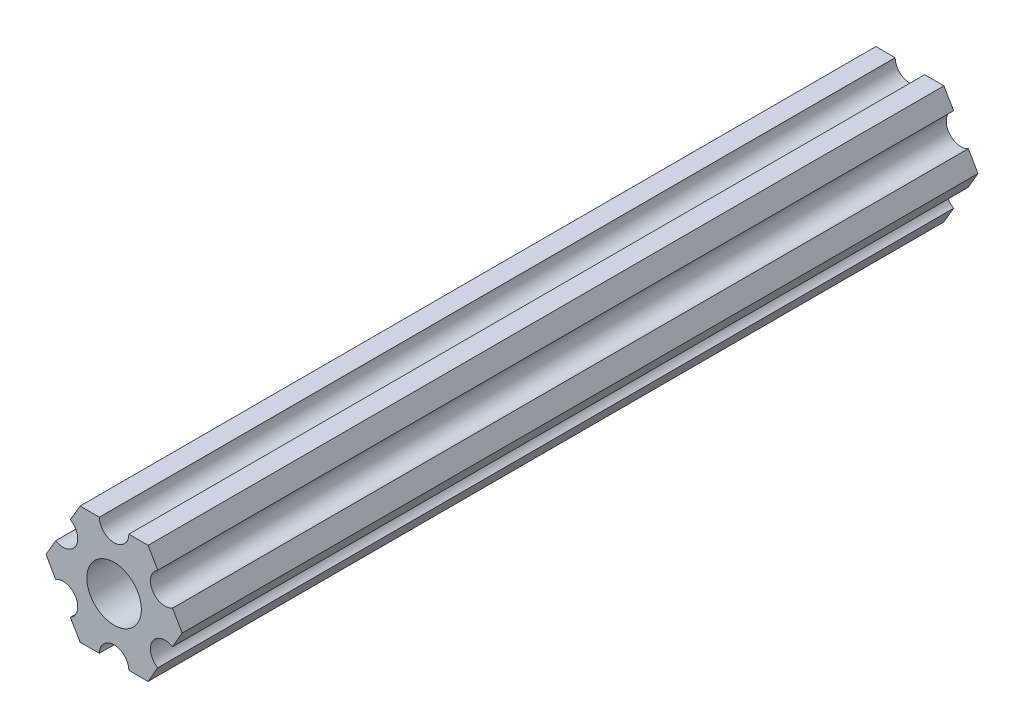
ISO-10303-21;
HEADER;
FILE_DESCRIPTION(('STEP AP214'),'2;1');
FILE_NAME('part.step','',(''),(''),'','','');
FILE_SCHEMA(('AUTOMOTIVE_DESIGN { 1 0 10303 214 1 1 1 1 }'));
ENDSEC;
DATA;
#1=APPLICATION_CONTEXT('core data for automotive mechanical design processes');
#2=APPLICATION_PROTOCOL_DEFINITION('international standard','automotive_design',2000,#1);
#3=PRODUCT_CONTEXT('',#1,'mechanical');
#4=PRODUCT('Part','Part','',(#3));
#5=PRODUCT_RELATED_PRODUCT_CATEGORY('part','',(#4));
#6=PRODUCT_DEFINITION_FORMATION('','',#4);
#7=PRODUCT_DEFINITION_CONTEXT('part definition',#1,'design');
#8=PRODUCT_DEFINITION('design','',#6,#7);
#9=PRODUCT_DEFINITION_SHAPE('','',#8);
#10=(LENGTH_UNIT() NAMED_UNIT(*) SI_UNIT(.MILLI.,.METRE.));
#11=(NAMED_UNIT(*) PLANE_ANGLE_UNIT() SI_UNIT($,.RADIAN.));
#12=(NAMED_UNIT(*) SI_UNIT($,.STERADIAN.) SOLID_ANGLE_UNIT());
#13=UNCERTAINTY_MEASURE_WITH_UNIT(LENGTH_MEASURE(1.E-05),#10,'distance_accuracy_value','');
#14=(GEOMETRIC_REPRESENTATION_CONTEXT(3) GLOBAL_UNCERTAINTY_ASSIGNED_CONTEXT((#13)) GLOBAL_UNIT_ASSIGNED_CONTEXT((#10,
#11,#12)) REPRESENTATION_CONTEXT('',''));
#15=CARTESIAN_POINT('',(0.,0.,0.));
#16=DIRECTION('',(0.,0.,1.));
#17=DIRECTION('',(1.,0.,0.));
#18=AXIS2_PLACEMENT_3D('',#15,#16,#17);
#19=CARTESIAN_POINT('',(5.49926169873049,-3.17500022210629,219.075));
#20=DIRECTION('',(0.,0.,1.));
#21=DIRECTION('',(1.,0.,0.));
#22=AXIS2_PLACEMENT_3D('',#19,#20,#21);
#23=CYLINDRICAL_SURFACE('',#22,1.5875);
#24=CARTESIAN_POINT('',(5.49926169873049,-3.17500022210629,304.8));
#25=DIRECTION('',(0.,0.,-1.));
#26=DIRECTION('',(-1.,0.,0.));
#27=AXIS2_PLACEMENT_3D('',#24,#25,#26);
#28=CIRCLE('',#27,1.5875);
#29=CARTESIAN_POINT('',(4.7055116987305,-4.5498155506141,304.8));
#30=VERTEX_POINT('',#29);
#31=CARTESIAN_POINT('',(6.29301169873047,-1.80018489359848,304.8));
#32=VERTEX_POINT('',#31);
#33=EDGE_CURVE('E190',#30,#32,#28,.T.);
#34=ORIENTED_EDGE('',*,*,#33,.F.);
#35=DIRECTION('',(0.,0.,1.));
#36=VECTOR('',#35,1.);
#37=CARTESIAN_POINT('',(4.7055116987305,-4.5498155506141,219.075));
#38=LINE('',#37,#36);
#39=CARTESIAN_POINT('',(4.7055116987305,-4.5498155506141,219.075));
#40=VERTEX_POINT('',#39);
#41=EDGE_CURVE('E11',#40,#30,#38,.T.);
#42=ORIENTED_EDGE('',*,*,#41,.F.);
#43=CARTESIAN_POINT('',(5.49926169873049,-3.17500022210629,219.075));
#44=DIRECTION('',(0.,0.,-1.));
#45=DIRECTION('',(-1.,0.,0.));
#46=AXIS2_PLACEMENT_3D('',#43,#44,#45);
#47=CIRCLE('',#46,1.5875);
#48=CARTESIAN_POINT('',(6.29301169873047,-1.80018489359848,219.075));
#49=VERTEX_POINT('',#48);
#50=EDGE_CURVE('E241',#40,#49,#47,.T.);
#51=ORIENTED_EDGE('',*,*,#50,.T.);
#52=DIRECTION('',(0.,0.,1.));
#53=VECTOR('',#52,1.);
#54=CARTESIAN_POINT('',(6.29301169873047,-1.80018489359848,219.075));
#55=LINE('',#54,#53);
#56=EDGE_CURVE('E36',#49,#32,#55,.T.);
#57=ORIENTED_EDGE('',*,*,#56,.T.);
#58=EDGE_LOOP('',(#34,#42,#51,#57));
#59=FACE_BOUND('',#58,.T.);
#60=ADVANCED_FACE('F33',(#59),#23,.F.);
#61=CARTESIAN_POINT('',(3.6661745940535,-6.35000022210627,219.075));
#62=DIRECTION('',(0.866025403784446,-0.499999999999988,0.));
#63=DIRECTION('',(0.499999999999988,0.866025403784446,0.));
#64=AXIS2_PLACEMENT_3D('',#61,#62,#63);
#65=PLANE('',#64);
#66=DIRECTION('',(0.499999999999988,0.866025403784446,0.));
#67=VECTOR('',#66,1.);
#68=CARTESIAN_POINT('',(3.6661745940535,-6.35000022210627,304.8));
#69=LINE('',#68,#67);
#70=CARTESIAN_POINT('',(3.6661745940535,-6.35000022210627,304.8));
#71=VERTEX_POINT('',#70);
#72=EDGE_CURVE('E239',#71,#30,#69,.T.);
#73=ORIENTED_EDGE('',*,*,#72,.F.);
#74=DIRECTION('',(0.,0.,1.));
#75=VECTOR('',#74,1.);
#76=CARTESIAN_POINT('',(3.6661745940535,-6.35000022210627,219.075));
#77=LINE('',#76,#75);
#78=CARTESIAN_POINT('',(3.6661745940535,-6.35000022210627,219.075));
#79=VERTEX_POINT('',#78);
#80=EDGE_CURVE('E42',#79,#71,#77,.T.);
#81=ORIENTED_EDGE('',*,*,#80,.F.);
#82=DIRECTION('',(0.499999999999988,0.866025403784446,0.));
#83=VECTOR('',#82,1.);
#84=CARTESIAN_POINT('',(3.6661745940535,-6.35000022210627,219.075));
#85=LINE('',#84,#83);
#86=EDGE_CURVE('E180',#79,#40,#85,.T.);
#87=ORIENTED_EDGE('',*,*,#86,.T.);
#88=ORIENTED_EDGE('',*,*,#41,.T.);
#89=EDGE_LOOP('',(#73,#81,#87,#88));
#90=FACE_BOUND('',#89,.T.);
#91=ADVANCED_FACE('F273',(#90),#65,.T.);
#92=CARTESIAN_POINT('',(1.58750038469929,-6.35000022210627,219.075));
#93=DIRECTION('',(0.,-1.,0.));
#94=DIRECTION('',(0.,0.,-1.));
#95=AXIS2_PLACEMENT_3D('',#92,#93,#94);
#96=PLANE('',#95);
#97=DIRECTION('',(1.,0.,0.));
#98=VECTOR('',#97,1.);
#99=CARTESIAN_POINT('',(1.58750038469929,-6.35000022210627,304.8));
#100=LINE('',#99,#98);
#101=CARTESIAN_POINT('',(1.58750038469929,-6.35000022210627,304.8));
#102=VERTEX_POINT('',#101);
#103=EDGE_CURVE('E167',#102,#71,#100,.T.);
#104=ORIENTED_EDGE('',*,*,#103,.F.);
#105=DIRECTION('',(0.,0.,1.));
#106=VECTOR('',#105,1.);
#107=CARTESIAN_POINT('',(1.58750038469929,-6.35000022210627,219.075));
#108=LINE('',#107,#106);
#109=CARTESIAN_POINT('',(1.58750038469929,-6.35000022210627,219.075));
#110=VERTEX_POINT('',#109);
#111=EDGE_CURVE('E162',#110,#102,#108,.T.);
#112=ORIENTED_EDGE('',*,*,#111,.F.);
#113=DIRECTION('',(1.,0.,0.));
#114=VECTOR('',#113,1.);
#115=CARTESIAN_POINT('',(1.58750038469929,-6.35000022210627,219.075));
#116=LINE('',#115,#114);
#117=EDGE_CURVE('E165',#110,#79,#116,.T.);
#118=ORIENTED_EDGE('',*,*,#117,.T.);
#119=ORIENTED_EDGE('',*,*,#80,.T.);
#120=EDGE_LOOP('',(#104,#112,#118,#119));
#121=FACE_BOUND('',#120,.T.);
#122=ADVANCED_FACE('F164',(#121),#96,.T.);
#123=CARTESIAN_POINT('',(3.84699290671026E-07,-6.35000022210627,219.075));
#124=DIRECTION('',(0.,0.,1.));
#125=DIRECTION('',(1.,0.,0.));
#126=AXIS2_PLACEMENT_3D('',#123,#124,#125);
#127=CYLINDRICAL_SURFACE('',#126,1.5875);
#128=CARTESIAN_POINT('',(3.84699290671026E-07,-6.35000022210627,304.8));
#129=DIRECTION('',(0.,0.,-1.));
#130=DIRECTION('',(-1.,0.,0.));
#131=AXIS2_PLACEMENT_3D('',#128,#129,#130);
#132=CIRCLE('',#131,1.5875);
#133=CARTESIAN_POINT('',(-1.58749961530071,-6.35000022210627,304.8));
#134=VERTEX_POINT('',#133);
#135=EDGE_CURVE('E236',#134,#102,#132,.T.);
#136=ORIENTED_EDGE('',*,*,#135,.F.);
#137=DIRECTION('',(0.,0.,1.));
#138=VECTOR('',#137,1.);
#139=CARTESIAN_POINT('',(-1.58749961530071,-6.35000022210627,219.075));
#140=LINE('',#139,#138);
#141=CARTESIAN_POINT('',(-1.58749961530071,-6.35000022210627,219.075));
#142=VERTEX_POINT('',#141);
#143=EDGE_CURVE('E172',#142,#134,#140,.T.);
#144=ORIENTED_EDGE('',*,*,#143,.F.);
#145=CARTESIAN_POINT('',(3.84699290671026E-07,-6.35000022210627,219.075));
#146=DIRECTION('',(0.,0.,-1.));
#147=DIRECTION('',(-1.,0.,0.));
#148=AXIS2_PLACEMENT_3D('',#145,#146,#147);
#149=CIRCLE('',#148,1.5875);
#150=EDGE_CURVE('E178',#142,#110,#149,.T.);
#151=ORIENTED_EDGE('',*,*,#150,.T.);
#152=ORIENTED_EDGE('',*,*,#111,.T.);
#153=EDGE_LOOP('',(#136,#144,#151,#152));
#154=FACE_BOUND('',#153,.T.);
#155=ADVANCED_FACE('F182',(#154),#127,.F.);
#156=CARTESIAN_POINT('',(-3.66617382465478,-6.35000022210627,219.075));
#157=DIRECTION('',(0.,-1.,0.));
#158=DIRECTION('',(1.,0.,0.));
#159=AXIS2_PLACEMENT_3D('',#156,#157,#158);
#160=PLANE('',#159);
#161=DIRECTION('',(1.,0.,0.));
#162=VECTOR('',#161,1.);
#163=CARTESIAN_POINT('',(-3.66617382465478,-6.35000022210627,304.8));
#164=LINE('',#163,#162);
#165=CARTESIAN_POINT('',(-3.66617382465478,-6.35000022210627,304.8));
#166=VERTEX_POINT('',#165);
#167=EDGE_CURVE('E233',#166,#134,#164,.T.);
#168=ORIENTED_EDGE('',*,*,#167,.F.);
#169=DIRECTION('',(0.,0.,1.));
#170=VECTOR('',#169,1.);
#171=CARTESIAN_POINT('',(-3.66617382465478,-6.35000022210627,219.075));
#172=LINE('',#171,#170);
#173=CARTESIAN_POINT('',(-3.66617382465478,-6.35000022210627,219.075));
#174=VERTEX_POINT('',#173);
#175=EDGE_CURVE('E245',#174,#166,#172,.T.);
#176=ORIENTED_EDGE('',*,*,#175,.F.);
#177=DIRECTION('',(1.,0.,0.));
#178=VECTOR('',#177,1.);
#179=CARTESIAN_POINT('',(-3.66617382465478,-6.35000022210627,219.075));
#180=LINE('',#179,#178);
#181=EDGE_CURVE('E183',#174,#142,#180,.T.);
#182=ORIENTED_EDGE('',*,*,#181,.T.);
#183=ORIENTED_EDGE('',*,*,#143,.T.);
#184=EDGE_LOOP('',(#168,#176,#182,#183));
#185=FACE_BOUND('',#184,.T.);
#186=ADVANCED_FACE('F286',(#185),#160,.T.);
#187=CARTESIAN_POINT('',(-4.70551103839171,-4.54981561357971,219.075));
#188=DIRECTION('',(-0.866025373493149,-0.500000052466048,0.));
#189=DIRECTION('',(0.500000052466048,-0.866025373493149,0.));
#190=AXIS2_PLACEMENT_3D('',#187,#188,#189);
#191=PLANE('',#190);
#192=DIRECTION('',(0.500000052466048,-0.866025373493149,0.));
#193=VECTOR('',#192,1.);
#194=CARTESIAN_POINT('',(-4.70551103839171,-4.54981561357971,304.8));
#195=LINE('',#194,#193);
#196=CARTESIAN_POINT('',(-4.70551103839171,-4.54981561357971,304.8));
#197=VERTEX_POINT('',#196);
#198=EDGE_CURVE('E230',#197,#166,#195,.T.);
#199=ORIENTED_EDGE('',*,*,#198,.F.);
#200=DIRECTION('',(0.,0.,1.));
#201=VECTOR('',#200,1.);
#202=CARTESIAN_POINT('',(-4.70551103839171,-4.54981561357971,219.075));
#203=LINE('',#202,#201);
#204=CARTESIAN_POINT('',(-4.70551103839171,-4.54981561357971,219.075));
#205=VERTEX_POINT('',#204);
#206=EDGE_CURVE('E247',#205,#197,#203,.T.);
#207=ORIENTED_EDGE('',*,*,#206,.F.);
#208=DIRECTION('',(0.500000052466048,-0.866025373493149,0.));
#209=VECTOR('',#208,1.);
#210=CARTESIAN_POINT('',(-4.70551103839171,-4.54981561357971,219.075));
#211=LINE('',#210,#209);
#212=EDGE_CURVE('E185',#205,#174,#211,.T.);
#213=ORIENTED_EDGE('',*,*,#212,.T.);
#214=ORIENTED_EDGE('',*,*,#175,.T.);
#215=EDGE_LOOP('',(#199,#207,#213,#214));
#216=FACE_BOUND('',#215,.T.);
#217=ADVANCED_FACE('F289',(#216),#191,.T.);
#218=CARTESIAN_POINT('',(-5.49926112168156,-3.17500033315934,219.075));
#219=DIRECTION('',(0.,0.,1.));
#220=DIRECTION('',(1.,0.,0.));
#221=AXIS2_PLACEMENT_3D('',#218,#219,#220);
#222=CYLINDRICAL_SURFACE('',#221,1.5875);
#223=CARTESIAN_POINT('',(-5.49926112168156,-3.17500033315934,304.8));
#224=DIRECTION('',(0.,0.,-1.));
#225=DIRECTION('',(-1.,0.,0.));
#226=AXIS2_PLACEMENT_3D('',#223,#224,#225);
#227=CIRCLE('',#226,1.5875);
#228=CARTESIAN_POINT('',(-6.29301120497141,-1.80018505273897,304.8));
#229=VERTEX_POINT('',#228);
#230=EDGE_CURVE('E227',#229,#197,#227,.T.);
#231=ORIENTED_EDGE('',*,*,#230,.F.);
#232=DIRECTION('',(0.,0.,1.));
#233=VECTOR('',#232,1.);
#234=CARTESIAN_POINT('',(-6.29301120497141,-1.80018505273897,219.075));
#235=LINE('',#234,#233);
#236=CARTESIAN_POINT('',(-6.29301120497141,-1.80018505273897,219.075));
#237=VERTEX_POINT('',#236);
#238=EDGE_CURVE('E249',#237,#229,#235,.T.);
#239=ORIENTED_EDGE('',*,*,#238,.F.);
#240=CARTESIAN_POINT('',(-5.49926112168156,-3.17500033315934,219.075));
#241=DIRECTION('',(0.,0.,-1.));
#242=DIRECTION('',(-1.,0.,0.));
#243=AXIS2_PLACEMENT_3D('',#240,#241,#242);
#244=CIRCLE('',#243,1.5875);
#245=EDGE_CURVE('E394',#237,#205,#244,.T.);
#246=ORIENTED_EDGE('',*,*,#245,.T.);
#247=ORIENTED_EDGE('',*,*,#206,.T.);
#248=EDGE_LOOP('',(#231,#239,#246,#247));
#249=FACE_BOUND('',#248,.T.);
#250=ADVANCED_FACE('F293',(#249),#222,.F.);
#251=CARTESIAN_POINT('',(-7.33234841870827,-4.44212523790841E-07,219.075));
#252=DIRECTION('',(-0.86602537349315,-0.500000052466048,0.));
#253=DIRECTION('',(0.500000052466048,-0.86602537349315,0.));
#254=AXIS2_PLACEMENT_3D('',#251,#252,#253);
#255=PLANE('',#254);
#256=DIRECTION('',(0.500000052466048,-0.86602537349315,0.));
#257=VECTOR('',#256,1.);
#258=CARTESIAN_POINT('',(-7.33234841870827,-4.44212523790841E-07,304.8));
#259=LINE('',#258,#257);
#260=CARTESIAN_POINT('',(-7.33234841870827,-4.44212523790841E-07,304.8));
#261=VERTEX_POINT('',#260);
#262=EDGE_CURVE('E224',#261,#229,#259,.T.);
#263=ORIENTED_EDGE('',*,*,#262,.F.);
#264=DIRECTION('',(0.,0.,1.));
#265=VECTOR('',#264,1.);
#266=CARTESIAN_POINT('',(-7.33234841870827,-4.44212523790841E-07,219.075));
#267=LINE('',#266,#265);
#268=CARTESIAN_POINT('',(-7.33234841870827,-4.44212523790841E-07,219.075));
#269=VERTEX_POINT('',#268);
#270=EDGE_CURVE('E251',#269,#261,#267,.T.);
#271=ORIENTED_EDGE('',*,*,#270,.F.);
#272=DIRECTION('',(0.500000052466048,-0.86602537349315,0.));
#273=VECTOR('',#272,1.);
#274=CARTESIAN_POINT('',(-7.33234841870827,-4.44212523790841E-07,219.075));
#275=LINE('',#274,#273);
#276=EDGE_CURVE('E391',#269,#237,#275,.T.);
#277=ORIENTED_EDGE('',*,*,#276,.T.);
#278=ORIENTED_EDGE('',*,*,#238,.T.);
#279=EDGE_LOOP('',(#263,#271,#277,#278));
#280=FACE_BOUND('',#279,.T.);
#281=ADVANCED_FACE('F297',(#280),#255,.T.);
#282=CARTESIAN_POINT('',(-6.29301142309098,1.80018429024547,219.075));
#283=DIRECTION('',(-0.866025434075722,0.499999947533955,0.));
#284=DIRECTION('',(-0.499999947533955,-0.866025434075722,0.));
#285=AXIS2_PLACEMENT_3D('',#282,#283,#284);
#286=PLANE('',#285);
#287=DIRECTION('',(-0.499999947533955,-0.866025434075722,0.));
#288=VECTOR('',#287,1.);
#289=CARTESIAN_POINT('',(-6.29301142309098,1.80018429024547,304.8));
#290=LINE('',#289,#288);
#291=CARTESIAN_POINT('',(-6.29301142309098,1.80018429024546,304.8));
#292=VERTEX_POINT('',#291);
#293=EDGE_CURVE('E221',#292,#261,#290,.T.);
#294=ORIENTED_EDGE('',*,*,#293,.F.);
#295=DIRECTION('',(0.,0.,1.));
#296=VECTOR('',#295,1.);
#297=CARTESIAN_POINT('',(-6.29301142309098,1.80018429024546,219.075));
#298=LINE('',#297,#296);
#299=CARTESIAN_POINT('',(-6.29301142309098,1.80018429024546,219.075));
#300=VERTEX_POINT('',#299);
#301=EDGE_CURVE('E253',#300,#292,#298,.T.);
#302=ORIENTED_EDGE('',*,*,#301,.F.);
#303=DIRECTION('',(-0.499999947533955,-0.866025434075722,0.));
#304=VECTOR('',#303,1.);
#305=CARTESIAN_POINT('',(-6.29301142309098,1.80018429024547,219.075));
#306=LINE('',#305,#304);
#307=EDGE_CURVE('E388',#300,#269,#306,.T.);
#308=ORIENTED_EDGE('',*,*,#307,.T.);
#309=ORIENTED_EDGE('',*,*,#270,.T.);
#310=EDGE_LOOP('',(#294,#302,#308,#309));
#311=FACE_BOUND('',#310,.T.);
#312=ADVANCED_FACE('F301',(#311),#286,.T.);
#313=CARTESIAN_POINT('',(-5.49926150638083,3.17499966684067,219.075));
#314=DIRECTION('',(0.,0.,1.));
#315=DIRECTION('',(1.,0.,0.));
#316=AXIS2_PLACEMENT_3D('',#313,#314,#315);
#317=CYLINDRICAL_SURFACE('',#316,1.5875);
#318=CARTESIAN_POINT('',(-5.49926150638083,3.17499966684067,304.8));
#319=DIRECTION('',(0.,0.,-1.));
#320=DIRECTION('',(-1.,0.,0.));
#321=AXIS2_PLACEMENT_3D('',#318,#319,#320);
#322=CIRCLE('',#321,1.5875);
#323=CARTESIAN_POINT('',(-4.70551158967067,4.54981504343588,304.8));
#324=VERTEX_POINT('',#323);
#325=EDGE_CURVE('E218',#324,#292,#322,.T.);
#326=ORIENTED_EDGE('',*,*,#325,.F.);
#327=DIRECTION('',(0.,0.,1.));
#328=VECTOR('',#327,1.);
#329=CARTESIAN_POINT('',(-4.70551158967067,4.54981504343588,219.075));
#330=LINE('',#329,#328);
#331=CARTESIAN_POINT('',(-4.70551158967067,4.54981504343588,219.075));
#332=VERTEX_POINT('',#331);
#333=EDGE_CURVE('E255',#332,#324,#330,.T.);
#334=ORIENTED_EDGE('',*,*,#333,.F.);
#335=CARTESIAN_POINT('',(-5.49926150638083,3.17499966684067,219.075));
#336=DIRECTION('',(0.,0.,-1.));
#337=DIRECTION('',(-1.,0.,0.));
#338=AXIS2_PLACEMENT_3D('',#335,#336,#337);
#339=CIRCLE('',#338,1.5875);
#340=EDGE_CURVE('E385',#332,#300,#339,.T.);
#341=ORIENTED_EDGE('',*,*,#340,.T.);
#342=ORIENTED_EDGE('',*,*,#301,.T.);
#343=EDGE_LOOP('',(#326,#334,#341,#342));
#344=FACE_BOUND('',#343,.T.);
#345=ADVANCED_FACE('F305',(#344),#317,.F.);
#346=CARTESIAN_POINT('',(-3.66617459405348,6.3499997778937,219.075));
#347=DIRECTION('',(-0.866025434075722,0.499999947533955,0.));
#348=DIRECTION('',(-0.499999947533955,-0.866025434075722,0.));
#349=AXIS2_PLACEMENT_3D('',#346,#347,#348);
#350=PLANE('',#349);
#351=DIRECTION('',(-0.499999947533955,-0.866025434075722,0.));
#352=VECTOR('',#351,1.);
#353=CARTESIAN_POINT('',(-3.66617459405348,6.3499997778937,304.8));
#354=LINE('',#353,#352);
#355=CARTESIAN_POINT('',(-3.66617459405348,6.3499997778937,304.8));
#356=VERTEX_POINT('',#355);
#357=EDGE_CURVE('E215',#356,#324,#354,.T.);
#358=ORIENTED_EDGE('',*,*,#357,.F.);
#359=DIRECTION('',(0.,0.,1.));
#360=VECTOR('',#359,1.);
#361=CARTESIAN_POINT('',(-3.66617459405348,6.3499997778937,219.075));
#362=LINE('',#361,#360);
#363=CARTESIAN_POINT('',(-3.66617459405348,6.3499997778937,219.075));
#364=VERTEX_POINT('',#363);
#365=EDGE_CURVE('E257',#364,#356,#362,.T.);
#366=ORIENTED_EDGE('',*,*,#365,.F.);
#367=DIRECTION('',(-0.499999947533955,-0.866025434075722,0.));
#368=VECTOR('',#367,1.);
#369=CARTESIAN_POINT('',(-3.66617459405348,6.3499997778937,219.075));
#370=LINE('',#369,#368);
#371=EDGE_CURVE('E382',#364,#332,#370,.T.);
#372=ORIENTED_EDGE('',*,*,#371,.T.);
#373=ORIENTED_EDGE('',*,*,#333,.T.);
#374=EDGE_LOOP('',(#358,#366,#372,#373));
#375=FACE_BOUND('',#374,.T.);
#376=ADVANCED_FACE('F309',(#375),#350,.T.);
#377=CARTESIAN_POINT('',(-1.58750038469926,6.3499997778937,219.075));
#378=DIRECTION('',(0.,1.,0.));
#379=DIRECTION('',(0.,0.,1.));
#380=AXIS2_PLACEMENT_3D('',#377,#378,#379);
#381=PLANE('',#380);
#382=DIRECTION('',(-1.,0.,0.));
#383=VECTOR('',#382,1.);
#384=CARTESIAN_POINT('',(-1.58750038469926,6.3499997778937,304.8));
#385=LINE('',#384,#383);
#386=CARTESIAN_POINT('',(-1.58750038469926,6.3499997778937,304.8));
#387=VERTEX_POINT('',#386);
#388=EDGE_CURVE('E212',#387,#356,#385,.T.);
#389=ORIENTED_EDGE('',*,*,#388,.F.);
#390=DIRECTION('',(0.,0.,1.));
#391=VECTOR('',#390,1.);
#392=CARTESIAN_POINT('',(-1.58750038469926,6.3499997778937,219.075));
#393=LINE('',#392,#391);
#394=CARTESIAN_POINT('',(-1.58750038469926,6.3499997778937,219.075));
#395=VERTEX_POINT('',#394);
#396=EDGE_CURVE('E259',#395,#387,#393,.T.);
#397=ORIENTED_EDGE('',*,*,#396,.F.);
#398=DIRECTION('',(-1.,0.,0.));
#399=VECTOR('',#398,1.);
#400=CARTESIAN_POINT('',(-1.58750038469926,6.3499997778937,219.075));
#401=LINE('',#400,#399);
#402=EDGE_CURVE('E379',#395,#364,#401,.T.);
#403=ORIENTED_EDGE('',*,*,#402,.T.);
#404=ORIENTED_EDGE('',*,*,#365,.T.);
#405=EDGE_LOOP('',(#389,#397,#403,#404));
#406=FACE_BOUND('',#405,.T.);
#407=ADVANCED_FACE('F313',(#406),#381,.T.);
#408=CARTESIAN_POINT('',(-3.84699252021695E-07,6.3499997778937,219.075));
#409=DIRECTION('',(0.,0.,1.));
#410=DIRECTION('',(1.,0.,0.));
#411=AXIS2_PLACEMENT_3D('',#408,#409,#410);
#412=CYLINDRICAL_SURFACE('',#411,1.5875);
#413=CARTESIAN_POINT('',(-3.84699252021695E-07,6.3499997778937,304.8));
#414=DIRECTION('',(0.,0.,-1.));
#415=DIRECTION('',(-1.,0.,0.));
#416=AXIS2_PLACEMENT_3D('',#413,#414,#415);
#417=CIRCLE('',#416,1.5875);
#418=CARTESIAN_POINT('',(1.58749961530075,6.3499997778937,304.8));
#419=VERTEX_POINT('',#418);
#420=EDGE_CURVE('E209',#419,#387,#417,.T.);
#421=ORIENTED_EDGE('',*,*,#420,.F.);
#422=DIRECTION('',(0.,0.,1.));
#423=VECTOR('',#422,1.);
#424=CARTESIAN_POINT('',(1.58749961530075,6.3499997778937,219.075));
#425=LINE('',#424,#423);
#426=CARTESIAN_POINT('',(1.58749961530075,6.3499997778937,219.075));
#427=VERTEX_POINT('',#426);
#428=EDGE_CURVE('E261',#427,#419,#425,.T.);
#429=ORIENTED_EDGE('',*,*,#428,.F.);
#430=CARTESIAN_POINT('',(-3.84699252021695E-07,6.3499997778937,219.075));
#431=DIRECTION('',(0.,0.,-1.));
#432=DIRECTION('',(-1.,0.,0.));
#433=AXIS2_PLACEMENT_3D('',#430,#431,#432);
#434=CIRCLE('',#433,1.5875);
#435=EDGE_CURVE('E376',#427,#395,#434,.T.);
#436=ORIENTED_EDGE('',*,*,#435,.T.);
#437=ORIENTED_EDGE('',*,*,#396,.T.);
#438=EDGE_LOOP('',(#421,#429,#436,#437));
#439=FACE_BOUND('',#438,.T.);
#440=ADVANCED_FACE('F317',(#439),#412,.F.);
#441=CARTESIAN_POINT('',(3.66617382465482,6.3499997778937,219.075));
#442=DIRECTION('',(0.,1.,0.));
#443=DIRECTION('',(0.,0.,1.));
#444=AXIS2_PLACEMENT_3D('',#441,#442,#443);
#445=PLANE('',#444);
#446=DIRECTION('',(-1.,0.,0.));
#447=VECTOR('',#446,1.);
#448=CARTESIAN_POINT('',(3.66617382465482,6.3499997778937,304.8));
#449=LINE('',#448,#447);
#450=CARTESIAN_POINT('',(3.66617382465482,6.3499997778937,304.8));
#451=VERTEX_POINT('',#450);
#452=EDGE_CURVE('E206',#451,#419,#449,.T.);
#453=ORIENTED_EDGE('',*,*,#452,.F.);
#454=DIRECTION('',(0.,0.,1.));
#455=VECTOR('',#454,1.);
#456=CARTESIAN_POINT('',(3.66617382465482,6.3499997778937,219.075));
#457=LINE('',#456,#455);
#458=CARTESIAN_POINT('',(3.66617382465482,6.3499997778937,219.075));
#459=VERTEX_POINT('',#458);
#460=EDGE_CURVE('E263',#459,#451,#457,.T.);
#461=ORIENTED_EDGE('',*,*,#460,.F.);
#462=DIRECTION('',(-1.,0.,0.));
#463=VECTOR('',#462,1.);
#464=CARTESIAN_POINT('',(3.66617382465482,6.3499997778937,219.075));
#465=LINE('',#464,#463);
#466=EDGE_CURVE('E373',#459,#427,#465,.T.);
#467=ORIENTED_EDGE('',*,*,#466,.T.);
#468=ORIENTED_EDGE('',*,*,#428,.T.);
#469=EDGE_LOOP('',(#453,#461,#467,#468));
#470=FACE_BOUND('',#469,.T.);
#471=ADVANCED_FACE('F321',(#470),#445,.T.);
#472=CARTESIAN_POINT('',(4.70551118909646,4.54981503427038,219.075));
#473=DIRECTION('',(0.866025358347505,0.500000078699069,0.));
#474=DIRECTION('',(-0.500000078699069,0.866025358347505,0.));
#475=AXIS2_PLACEMENT_3D('',#472,#473,#474);
#476=PLANE('',#475);
#477=DIRECTION('',(-0.500000078699069,0.866025358347505,0.));
#478=VECTOR('',#477,1.);
#479=CARTESIAN_POINT('',(4.70551118909646,4.54981503427038,304.8));
#480=LINE('',#479,#478);
#481=CARTESIAN_POINT('',(4.70551118909646,4.54981503427038,304.8));
#482=VERTEX_POINT('',#481);
#483=EDGE_CURVE('E203',#482,#451,#480,.T.);
#484=ORIENTED_EDGE('',*,*,#483,.F.);
#485=DIRECTION('',(0.,0.,1.));
#486=VECTOR('',#485,1.);
#487=CARTESIAN_POINT('',(4.70551118909646,4.54981503427038,219.075));
#488=LINE('',#487,#486);
#489=CARTESIAN_POINT('',(4.70551118909646,4.54981503427038,219.075));
#490=VERTEX_POINT('',#489);
#491=EDGE_CURVE('E265',#490,#482,#488,.T.);
#492=ORIENTED_EDGE('',*,*,#491,.F.);
#493=DIRECTION('',(-0.500000078699069,0.866025358347505,0.));
#494=VECTOR('',#493,1.);
#495=CARTESIAN_POINT('',(4.70551118909646,4.54981503427038,219.075));
#496=LINE('',#495,#494);
#497=EDGE_CURVE('E370',#490,#459,#496,.T.);
#498=ORIENTED_EDGE('',*,*,#497,.T.);
#499=ORIENTED_EDGE('',*,*,#460,.T.);
#500=EDGE_LOOP('',(#484,#492,#498,#499));
#501=FACE_BOUND('',#500,.T.);
#502=ADVANCED_FACE('F325',(#501),#476,.T.);
#503=CARTESIAN_POINT('',(5.49926131403124,3.17499977789371,219.075));
#504=DIRECTION('',(0.,0.,1.));
#505=DIRECTION('',(1.,0.,0.));
#506=AXIS2_PLACEMENT_3D('',#503,#504,#505);
#507=CYLINDRICAL_SURFACE('',#506,1.5875);
#508=CARTESIAN_POINT('',(5.49926131403124,3.17499977789371,304.8));
#509=DIRECTION('',(0.,0.,-1.));
#510=DIRECTION('',(-1.,0.,0.));
#511=AXIS2_PLACEMENT_3D('',#508,#509,#510);
#512=CIRCLE('',#511,1.5875);
#513=CARTESIAN_POINT('',(6.29301143896601,1.80018452151705,304.8));
#514=VERTEX_POINT('',#513);
#515=EDGE_CURVE('E200',#514,#482,#512,.T.);
#516=ORIENTED_EDGE('',*,*,#515,.F.);
#517=DIRECTION('',(0.,0.,1.));
#518=VECTOR('',#517,1.);
#519=CARTESIAN_POINT('',(6.29301143896601,1.80018452151705,219.075));
#520=LINE('',#519,#518);
#521=CARTESIAN_POINT('',(6.29301143896601,1.80018452151705,219.075));
#522=VERTEX_POINT('',#521);
#523=EDGE_CURVE('E267',#522,#514,#520,.T.);
#524=ORIENTED_EDGE('',*,*,#523,.F.);
#525=CARTESIAN_POINT('',(5.49926131403124,3.17499977789371,219.075));
#526=DIRECTION('',(0.,0.,-1.));
#527=DIRECTION('',(-1.,0.,0.));
#528=AXIS2_PLACEMENT_3D('',#525,#526,#527);
#529=CIRCLE('',#528,1.5875);
#530=EDGE_CURVE('E367',#522,#490,#529,.T.);
#531=ORIENTED_EDGE('',*,*,#530,.T.);
#532=ORIENTED_EDGE('',*,*,#491,.T.);
#533=EDGE_LOOP('',(#516,#524,#531,#532));
#534=FACE_BOUND('',#533,.T.);
#535=ADVANCED_FACE('F329',(#534),#507,.F.);
#536=CARTESIAN_POINT('',(7.33234880340755,-2.22106190273918E-07,219.075));
#537=DIRECTION('',(0.866025358347517,0.500000078699048,0.));
#538=DIRECTION('',(-0.500000078699048,0.866025358347517,0.));
#539=AXIS2_PLACEMENT_3D('',#536,#537,#538);
#540=PLANE('',#539);
#541=DIRECTION('',(-0.500000078699048,0.866025358347517,0.));
#542=VECTOR('',#541,1.);
#543=CARTESIAN_POINT('',(7.33234880340755,-2.22106190273918E-07,304.8));
#544=LINE('',#543,#542);
#545=CARTESIAN_POINT('',(7.33234880340755,-2.22106190273918E-07,304.8));
#546=VERTEX_POINT('',#545);
#547=EDGE_CURVE('E197',#546,#514,#544,.T.);
#548=ORIENTED_EDGE('',*,*,#547,.F.);
#549=DIRECTION('',(0.,0.,1.));
#550=VECTOR('',#549,1.);
#551=CARTESIAN_POINT('',(7.33234880340755,-2.22106190273918E-07,219.075));
#552=LINE('',#551,#550);
#553=CARTESIAN_POINT('',(7.33234880340755,-2.22106190273918E-07,219.075));
#554=VERTEX_POINT('',#553);
#555=EDGE_CURVE('E268',#554,#546,#552,.T.);
#556=ORIENTED_EDGE('',*,*,#555,.F.);
#557=DIRECTION('',(-0.500000078699048,0.866025358347517,0.));
#558=VECTOR('',#557,1.);
#559=CARTESIAN_POINT('',(7.33234880340755,-2.22106190273918E-07,219.075));
#560=LINE('',#559,#558);
#561=EDGE_CURVE('E364',#554,#522,#560,.T.);
#562=ORIENTED_EDGE('',*,*,#561,.T.);
#563=ORIENTED_EDGE('',*,*,#523,.T.);
#564=EDGE_LOOP('',(#548,#556,#562,#563));
#565=FACE_BOUND('',#564,.T.);
#566=ADVANCED_FACE('F333',(#565),#540,.T.);
#567=CARTESIAN_POINT('',(6.29301169873047,-1.80018489359848,219.075));
#568=DIRECTION('',(0.866025403784446,-0.499999999999988,0.));
#569=DIRECTION('',(0.499999999999988,0.866025403784446,0.));
#570=AXIS2_PLACEMENT_3D('',#567,#568,#569);
#571=PLANE('',#570);
#572=DIRECTION('',(0.499999999999988,0.866025403784446,0.));
#573=VECTOR('',#572,1.);
#574=CARTESIAN_POINT('',(6.29301169873047,-1.80018489359848,304.8));
#575=LINE('',#574,#573);
#576=EDGE_CURVE('E193',#32,#546,#575,.T.);
#577=ORIENTED_EDGE('',*,*,#576,.F.);
#578=ORIENTED_EDGE('',*,*,#56,.F.);
#579=DIRECTION('',(0.499999999999988,0.866025403784446,0.));
#580=VECTOR('',#579,1.);
#581=CARTESIAN_POINT('',(6.29301169873047,-1.80018489359848,219.075));
#582=LINE('',#581,#580);
#583=EDGE_CURVE('E362',#49,#554,#582,.T.);
#584=ORIENTED_EDGE('',*,*,#583,.T.);
#585=ORIENTED_EDGE('',*,*,#555,.T.);
#586=EDGE_LOOP('',(#577,#578,#584,#585));
#587=FACE_BOUND('',#586,.T.);
#588=ADVANCED_FACE('F270',(#587),#571,.T.);
#589=CARTESIAN_POINT('',(5.49926169873049,-3.17500022210629,219.075));
#590=DIRECTION('',(0.,0.,-1.));
#591=DIRECTION('',(-1.,0.,0.));
#592=AXIS2_PLACEMENT_3D('',#589,#590,#591);
#593=PLANE('',#592);
#594=CARTESIAN_POINT('',(0.,0.,219.075));
#595=DIRECTION('',(0.,0.,1.));
#596=DIRECTION('',(-1.,0.,0.));
#597=AXIS2_PLACEMENT_3D('',#594,#595,#596);
#598=CIRCLE('',#597,2.9337);
#599=CARTESIAN_POINT('',(-2.9337,0.,219.075));
#600=VERTEX_POINT('',#599);
#601=EDGE_CURVE('E194',#600,#600,#598,.T.);
#602=ORIENTED_EDGE('',*,*,#601,.T.);
#603=EDGE_LOOP('',(#602));
#604=FACE_BOUND('',#603,.T.);
#605=ORIENTED_EDGE('',*,*,#50,.F.);
#606=ORIENTED_EDGE('',*,*,#86,.F.);
#607=ORIENTED_EDGE('',*,*,#117,.F.);
#608=ORIENTED_EDGE('',*,*,#150,.F.);
#609=ORIENTED_EDGE('',*,*,#181,.F.);
#610=ORIENTED_EDGE('',*,*,#212,.F.);
#611=ORIENTED_EDGE('',*,*,#245,.F.);
#612=ORIENTED_EDGE('',*,*,#276,.F.);
#613=ORIENTED_EDGE('',*,*,#307,.F.);
#614=ORIENTED_EDGE('',*,*,#340,.F.);
#615=ORIENTED_EDGE('',*,*,#371,.F.);
#616=ORIENTED_EDGE('',*,*,#402,.F.);
#617=ORIENTED_EDGE('',*,*,#435,.F.);
#618=ORIENTED_EDGE('',*,*,#466,.F.);
#619=ORIENTED_EDGE('',*,*,#497,.F.);
#620=ORIENTED_EDGE('',*,*,#530,.F.);
#621=ORIENTED_EDGE('',*,*,#561,.F.);
#622=ORIENTED_EDGE('',*,*,#583,.F.);
#623=EDGE_LOOP('',(#605,#606,#607,#608,#609,#610,#611,#612,#613,#614,#615,#616,#617,#618,#619,
#620,#621,#622));
#624=FACE_BOUND('',#623,.T.);
#625=ADVANCED_FACE('F176',(#604,#624),#593,.T.);
#626=CARTESIAN_POINT('',(5.49926169873049,-3.17500022210629,304.8));
#627=DIRECTION('',(0.,0.,-1.));
#628=DIRECTION('',(-1.,0.,0.));
#629=AXIS2_PLACEMENT_3D('',#626,#627,#628);
#630=PLANE('',#629);
#631=CARTESIAN_POINT('',(0.,0.,304.8));
#632=DIRECTION('',(0.,0.,1.));
#633=DIRECTION('',(-1.,0.,0.));
#634=AXIS2_PLACEMENT_3D('',#631,#632,#633);
#635=CIRCLE('',#634,2.9337);
#636=CARTESIAN_POINT('',(-2.9337,0.,304.8));
#637=VERTEX_POINT('',#636);
#638=EDGE_CURVE('E357',#637,#637,#635,.T.);
#639=ORIENTED_EDGE('',*,*,#638,.F.);
#640=EDGE_LOOP('',(#639));
#641=FACE_BOUND('',#640,.T.);
#642=ORIENTED_EDGE('',*,*,#33,.T.);
#643=ORIENTED_EDGE('',*,*,#576,.T.);
#644=ORIENTED_EDGE('',*,*,#547,.T.);
#645=ORIENTED_EDGE('',*,*,#515,.T.);
#646=ORIENTED_EDGE('',*,*,#483,.T.);
#647=ORIENTED_EDGE('',*,*,#452,.T.);
#648=ORIENTED_EDGE('',*,*,#420,.T.);
#649=ORIENTED_EDGE('',*,*,#388,.T.);
#650=ORIENTED_EDGE('',*,*,#357,.T.);
#651=ORIENTED_EDGE('',*,*,#325,.T.);
#652=ORIENTED_EDGE('',*,*,#293,.T.);
#653=ORIENTED_EDGE('',*,*,#262,.T.);
#654=ORIENTED_EDGE('',*,*,#230,.T.);
#655=ORIENTED_EDGE('',*,*,#198,.T.);
#656=ORIENTED_EDGE('',*,*,#167,.T.);
#657=ORIENTED_EDGE('',*,*,#135,.T.);
#658=ORIENTED_EDGE('',*,*,#103,.T.);
#659=ORIENTED_EDGE('',*,*,#72,.T.);
#660=EDGE_LOOP('',(#642,#643,#644,#645,#646,#647,#648,#649,#650,#651,#652,#653,#654,#655,#656,
#657,#658,#659));
#661=FACE_BOUND('',#660,.T.);
#662=ADVANCED_FACE('F272',(#641,#661),#630,.F.);
#663=CARTESIAN_POINT('',(0.,0.,219.075));
#664=DIRECTION('',(0.,0.,1.));
#665=DIRECTION('',(1.,0.,0.));
#666=AXIS2_PLACEMENT_3D('',#663,#664,#665);
#667=CYLINDRICAL_SURFACE('',#666,2.9337);
#668=ORIENTED_EDGE('',*,*,#601,.F.);
#669=EDGE_LOOP('',(#668));
#670=FACE_BOUND('',#669,.T.);
#671=ORIENTED_EDGE('',*,*,#638,.T.);
#672=EDGE_LOOP('',(#671));
#673=FACE_BOUND('',#672,.T.);
#674=ADVANCED_FACE('F345',(#670,#673),#667,.F.);
#675=CLOSED_SHELL('',(#60,#91,#122,#155,#186,#217,#250,#281,#312,#345,#376,#407,#440,#471,#502,
#535,#566,#588,#625,#662,#674));
#676=MANIFOLD_SOLID_BREP('B2',#675);
#677=ADVANCED_BREP_SHAPE_REPRESENTATION('',(#18,#676),#14);
#678=SHAPE_DEFINITION_REPRESENTATION(#9,#677);
ENDSEC;
END-ISO-10303-21;
